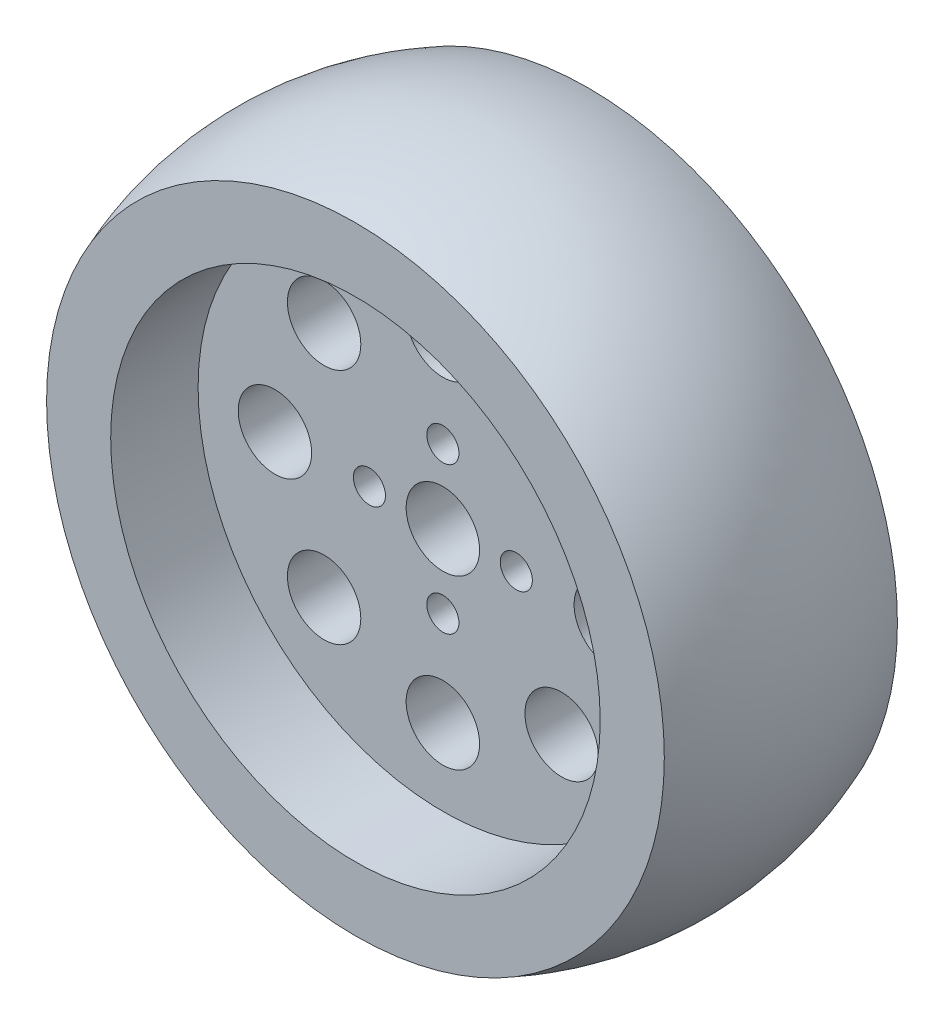
ISO-10303-21;
HEADER;
FILE_DESCRIPTION(('STEP AP214'),'2;1');
FILE_NAME('part.step','',(''),(''),'','','');
FILE_SCHEMA(('AUTOMOTIVE_DESIGN { 1 0 10303 214 1 1 1 1 }'));
ENDSEC;
DATA;
#1=APPLICATION_CONTEXT('core data for automotive mechanical design processes');
#2=APPLICATION_PROTOCOL_DEFINITION('international standard','automotive_design',2000,#1);
#3=PRODUCT_CONTEXT('',#1,'mechanical');
#4=PRODUCT('Part','Part','',(#3));
#5=PRODUCT_RELATED_PRODUCT_CATEGORY('part','',(#4));
#6=PRODUCT_DEFINITION_FORMATION('','',#4);
#7=PRODUCT_DEFINITION_CONTEXT('part definition',#1,'design');
#8=PRODUCT_DEFINITION('design','',#6,#7);
#9=PRODUCT_DEFINITION_SHAPE('','',#8);
#10=(LENGTH_UNIT() NAMED_UNIT(*) SI_UNIT(.MILLI.,.METRE.));
#11=(NAMED_UNIT(*) PLANE_ANGLE_UNIT() SI_UNIT($,.RADIAN.));
#12=(NAMED_UNIT(*) SI_UNIT($,.STERADIAN.) SOLID_ANGLE_UNIT());
#13=UNCERTAINTY_MEASURE_WITH_UNIT(LENGTH_MEASURE(1.E-05),#10,'distance_accuracy_value','');
#14=(GEOMETRIC_REPRESENTATION_CONTEXT(3) GLOBAL_UNCERTAINTY_ASSIGNED_CONTEXT((#13)) GLOBAL_UNIT_ASSIGNED_CONTEXT((#10,
#11,#12)) REPRESENTATION_CONTEXT('',''));
#15=CARTESIAN_POINT('',(0.,0.,0.));
#16=DIRECTION('',(0.,0.,1.));
#17=DIRECTION('',(1.,0.,0.));
#18=AXIS2_PLACEMENT_3D('',#15,#16,#17);
#19=CARTESIAN_POINT('',(0.,0.,2.159));
#20=DIRECTION('',(0.,0.,1.));
#21=DIRECTION('',(1.,0.,0.));
#22=AXIS2_PLACEMENT_3D('',#19,#20,#21);
#23=PLANE('',#22);
#24=CARTESIAN_POINT('',(0.,0.,2.159));
#25=DIRECTION('',(0.,0.,1.));
#26=DIRECTION('',(1.,0.,0.));
#27=AXIS2_PLACEMENT_3D('',#24,#25,#26);
#28=CIRCLE('',#27,26.67);
#29=CARTESIAN_POINT('',(26.67,0.,2.159));
#30=VERTEX_POINT('',#29);
#31=EDGE_CURVE('E43',#30,#30,#28,.T.);
#32=ORIENTED_EDGE('',*,*,#31,.F.);
#33=EDGE_LOOP('',(#32));
#34=FACE_BOUND('',#33,.T.);
#35=CARTESIAN_POINT('',(0.,0.,2.159));
#36=DIRECTION('',(0.,0.,-1.));
#37=DIRECTION('',(-1.,0.,0.));
#38=AXIS2_PLACEMENT_3D('',#35,#36,#37);
#39=CIRCLE('',#38,33.655);
#40=CARTESIAN_POINT('',(-33.655,0.,2.159));
#41=VERTEX_POINT('',#40);
#42=EDGE_CURVE('E50',#41,#41,#39,.T.);
#43=ORIENTED_EDGE('',*,*,#42,.F.);
#44=EDGE_LOOP('',(#43));
#45=FACE_BOUND('',#44,.T.);
#46=ADVANCED_FACE('F30',(#34,#45),#23,.T.);
#47=CARTESIAN_POINT('',(0.,0.,-7.366));
#48=DIRECTION('',(0.,0.,1.));
#49=DIRECTION('',(1.,0.,0.));
#50=AXIS2_PLACEMENT_3D('',#47,#48,#49);
#51=PLANE('',#50);
#52=CARTESIAN_POINT('',(-12.9400540957138,12.9400540957138,-7.366));
#53=DIRECTION('',(0.,0.,1.));
#54=DIRECTION('',(1.,0.,0.));
#55=AXIS2_PLACEMENT_3D('',#52,#53,#54);
#56=CIRCLE('',#55,4.);
#57=CARTESIAN_POINT('',(-8.94005409571382,12.9400540957138,-7.366));
#58=VERTEX_POINT('',#57);
#59=EDGE_CURVE('E103',#58,#58,#56,.T.);
#60=ORIENTED_EDGE('',*,*,#59,.F.);
#61=EDGE_LOOP('',(#60));
#62=FACE_BOUND('',#61,.T.);
#63=CARTESIAN_POINT('',(-12.9400540957138,-12.9400540957138,-7.366));
#64=DIRECTION('',(0.,0.,1.));
#65=DIRECTION('',(1.,0.,0.));
#66=AXIS2_PLACEMENT_3D('',#63,#64,#65);
#67=CIRCLE('',#66,4.);
#68=CARTESIAN_POINT('',(-8.94005409571382,-12.9400540957138,-7.366));
#69=VERTEX_POINT('',#68);
#70=EDGE_CURVE('E93',#69,#69,#67,.T.);
#71=ORIENTED_EDGE('',*,*,#70,.F.);
#72=EDGE_LOOP('',(#71));
#73=FACE_BOUND('',#72,.T.);
#74=CARTESIAN_POINT('',(12.9400540957138,-12.9400540957138,-7.366));
#75=DIRECTION('',(0.,0.,1.));
#76=DIRECTION('',(1.,0.,0.));
#77=AXIS2_PLACEMENT_3D('',#74,#75,#76);
#78=CIRCLE('',#77,4.);
#79=CARTESIAN_POINT('',(16.9400540957138,-12.9400540957138,-7.366));
#80=VERTEX_POINT('',#79);
#81=EDGE_CURVE('E90',#80,#80,#78,.T.);
#82=ORIENTED_EDGE('',*,*,#81,.F.);
#83=EDGE_LOOP('',(#82));
#84=FACE_BOUND('',#83,.T.);
#85=CARTESIAN_POINT('',(12.9400540957138,12.9400540957138,-7.366));
#86=DIRECTION('',(0.,0.,1.));
#87=DIRECTION('',(1.,0.,0.));
#88=AXIS2_PLACEMENT_3D('',#85,#86,#87);
#89=CIRCLE('',#88,4.);
#90=CARTESIAN_POINT('',(16.9400540957138,12.9400540957138,-7.366));
#91=VERTEX_POINT('',#90);
#92=EDGE_CURVE('E87',#91,#91,#89,.T.);
#93=ORIENTED_EDGE('',*,*,#92,.F.);
#94=EDGE_LOOP('',(#93));
#95=FACE_BOUND('',#94,.T.);
#96=CARTESIAN_POINT('',(-18.3,0.,-7.366));
#97=DIRECTION('',(0.,0.,1.));
#98=DIRECTION('',(1.,0.,0.));
#99=AXIS2_PLACEMENT_3D('',#96,#97,#98);
#100=CIRCLE('',#99,4.);
#101=CARTESIAN_POINT('',(-14.3,0.,-7.366));
#102=VERTEX_POINT('',#101);
#103=EDGE_CURVE('E83',#102,#102,#100,.T.);
#104=ORIENTED_EDGE('',*,*,#103,.F.);
#105=EDGE_LOOP('',(#104));
#106=FACE_BOUND('',#105,.T.);
#107=CARTESIAN_POINT('',(0.,-18.3,-7.366));
#108=DIRECTION('',(0.,0.,1.));
#109=DIRECTION('',(1.,0.,0.));
#110=AXIS2_PLACEMENT_3D('',#107,#108,#109);
#111=CIRCLE('',#110,4.);
#112=CARTESIAN_POINT('',(4.,-18.3,-7.366));
#113=VERTEX_POINT('',#112);
#114=EDGE_CURVE('E79',#113,#113,#111,.T.);
#115=ORIENTED_EDGE('',*,*,#114,.F.);
#116=EDGE_LOOP('',(#115));
#117=FACE_BOUND('',#116,.T.);
#118=CARTESIAN_POINT('',(18.3,0.,-7.366));
#119=DIRECTION('',(0.,0.,1.));
#120=DIRECTION('',(1.,0.,0.));
#121=AXIS2_PLACEMENT_3D('',#118,#119,#120);
#122=CIRCLE('',#121,4.);
#123=CARTESIAN_POINT('',(22.3,0.,-7.366));
#124=VERTEX_POINT('',#123);
#125=EDGE_CURVE('E75',#124,#124,#122,.T.);
#126=ORIENTED_EDGE('',*,*,#125,.F.);
#127=EDGE_LOOP('',(#126));
#128=FACE_BOUND('',#127,.T.);
#129=CARTESIAN_POINT('',(0.,18.3,-7.366));
#130=DIRECTION('',(0.,0.,1.));
#131=DIRECTION('',(1.,0.,0.));
#132=AXIS2_PLACEMENT_3D('',#129,#130,#131);
#133=CIRCLE('',#132,4.);
#134=CARTESIAN_POINT('',(4.,18.3,-7.366));
#135=VERTEX_POINT('',#134);
#136=EDGE_CURVE('E71',#135,#135,#133,.T.);
#137=ORIENTED_EDGE('',*,*,#136,.F.);
#138=EDGE_LOOP('',(#137));
#139=FACE_BOUND('',#138,.T.);
#140=CARTESIAN_POINT('',(-8.,0.,-7.366));
#141=DIRECTION('',(0.,0.,1.));
#142=DIRECTION('',(1.,0.,0.));
#143=AXIS2_PLACEMENT_3D('',#140,#141,#142);
#144=CIRCLE('',#143,1.75);
#145=CARTESIAN_POINT('',(-6.25,0.,-7.366));
#146=VERTEX_POINT('',#145);
#147=EDGE_CURVE('E67',#146,#146,#144,.T.);
#148=ORIENTED_EDGE('',*,*,#147,.F.);
#149=EDGE_LOOP('',(#148));
#150=FACE_BOUND('',#149,.T.);
#151=CARTESIAN_POINT('',(0.,-8.,-7.366));
#152=DIRECTION('',(0.,0.,1.));
#153=DIRECTION('',(1.,0.,0.));
#154=AXIS2_PLACEMENT_3D('',#151,#152,#153);
#155=CIRCLE('',#154,1.75);
#156=CARTESIAN_POINT('',(1.75,-8.,-7.366));
#157=VERTEX_POINT('',#156);
#158=EDGE_CURVE('E63',#157,#157,#155,.T.);
#159=ORIENTED_EDGE('',*,*,#158,.F.);
#160=EDGE_LOOP('',(#159));
#161=FACE_BOUND('',#160,.T.);
#162=CARTESIAN_POINT('',(8.,0.,-7.366));
#163=DIRECTION('',(0.,0.,1.));
#164=DIRECTION('',(1.,0.,0.));
#165=AXIS2_PLACEMENT_3D('',#162,#163,#164);
#166=CIRCLE('',#165,1.75);
#167=CARTESIAN_POINT('',(9.75,0.,-7.366));
#168=VERTEX_POINT('',#167);
#169=EDGE_CURVE('E59',#168,#168,#166,.T.);
#170=ORIENTED_EDGE('',*,*,#169,.F.);
#171=EDGE_LOOP('',(#170));
#172=FACE_BOUND('',#171,.T.);
#173=CARTESIAN_POINT('',(0.,8.,-7.366));
#174=DIRECTION('',(0.,0.,1.));
#175=DIRECTION('',(1.,0.,0.));
#176=AXIS2_PLACEMENT_3D('',#173,#174,#175);
#177=CIRCLE('',#176,1.75);
#178=CARTESIAN_POINT('',(1.75,8.,-7.366));
#179=VERTEX_POINT('',#178);
#180=EDGE_CURVE('E55',#179,#179,#177,.T.);
#181=ORIENTED_EDGE('',*,*,#180,.F.);
#182=EDGE_LOOP('',(#181));
#183=FACE_BOUND('',#182,.T.);
#184=CARTESIAN_POINT('',(0.,0.,-7.366));
#185=DIRECTION('',(0.,0.,1.));
#186=DIRECTION('',(1.,0.,0.));
#187=AXIS2_PLACEMENT_3D('',#184,#185,#186);
#188=CIRCLE('',#187,4.);
#189=CARTESIAN_POINT('',(4.,0.,-7.366));
#190=VERTEX_POINT('',#189);
#191=EDGE_CURVE('E51',#190,#190,#188,.T.);
#192=ORIENTED_EDGE('',*,*,#191,.F.);
#193=EDGE_LOOP('',(#192));
#194=FACE_BOUND('',#193,.T.);
#195=CARTESIAN_POINT('',(0.,0.,-7.366));
#196=DIRECTION('',(0.,0.,1.));
#197=DIRECTION('',(1.,0.,0.));
#198=AXIS2_PLACEMENT_3D('',#195,#196,#197);
#199=CIRCLE('',#198,26.67);
#200=CARTESIAN_POINT('',(26.67,0.,-7.366));
#201=VERTEX_POINT('',#200);
#202=EDGE_CURVE('E10',#201,#201,#199,.T.);
#203=ORIENTED_EDGE('',*,*,#202,.T.);
#204=EDGE_LOOP('',(#203));
#205=FACE_BOUND('',#204,.T.);
#206=ADVANCED_FACE('F139',(#62,#73,#84,#95,#106,#117,#128,#139,#150,#161,#172,#183,#194,#205),
#51,.T.);
#207=CARTESIAN_POINT('',(0.,0.,-7.366));
#208=DIRECTION('',(0.,0.,1.));
#209=DIRECTION('',(1.,0.,0.));
#210=AXIS2_PLACEMENT_3D('',#207,#208,#209);
#211=CYLINDRICAL_SURFACE('',#210,26.67);
#212=ORIENTED_EDGE('',*,*,#202,.F.);
#213=EDGE_LOOP('',(#212));
#214=FACE_BOUND('',#213,.T.);
#215=ORIENTED_EDGE('',*,*,#31,.T.);
#216=EDGE_LOOP('',(#215));
#217=FACE_BOUND('',#216,.T.);
#218=ADVANCED_FACE('F32',(#214,#217),#211,.F.);
#219=CARTESIAN_POINT('',(0.,0.,-10.541));
#220=DIRECTION('',(0.,0.,-1.));
#221=DIRECTION('',(-1.,0.,0.));
#222=AXIS2_PLACEMENT_3D('',#219,#220,#221);
#223=DEGENERATE_TOROIDAL_SURFACE('',#222,1.8774674519895,34.2213613820355,.T.);
#224=CARTESIAN_POINT('',(0.,0.,-23.241));
#225=DIRECTION('',(0.,0.,-1.));
#226=DIRECTION('',(-1.,0.,0.));
#227=AXIS2_PLACEMENT_3D('',#224,#225,#226);
#228=CIRCLE('',#227,33.655);
#229=CARTESIAN_POINT('',(-33.655,0.,-23.241));
#230=VERTEX_POINT('',#229);
#231=EDGE_CURVE('E128',#230,#230,#228,.T.);
#232=ORIENTED_EDGE('',*,*,#231,.F.);
#233=EDGE_LOOP('',(#232));
#234=FACE_BOUND('',#233,.T.);
#235=ORIENTED_EDGE('',*,*,#42,.T.);
#236=EDGE_LOOP('',(#235));
#237=FACE_BOUND('',#236,.T.);
#238=ADVANCED_FACE('F143',(#234,#237),#223,.T.);
#239=CARTESIAN_POINT('',(0.,0.,-13.716));
#240=DIRECTION('',(0.,0.,-1.));
#241=DIRECTION('',(-1.,0.,0.));
#242=AXIS2_PLACEMENT_3D('',#239,#240,#241);
#243=PLANE('',#242);
#244=CARTESIAN_POINT('',(-12.9400540957138,12.9400540957138,-13.716));
#245=DIRECTION('',(0.,0.,-1.));
#246=DIRECTION('',(-1.,0.,0.));
#247=AXIS2_PLACEMENT_3D('',#244,#245,#246);
#248=CIRCLE('',#247,4.);
#249=CARTESIAN_POINT('',(-16.9400540957138,12.9400540957138,-13.716));
#250=VERTEX_POINT('',#249);
#251=EDGE_CURVE('E34',#250,#250,#248,.T.);
#252=ORIENTED_EDGE('',*,*,#251,.F.);
#253=EDGE_LOOP('',(#252));
#254=FACE_BOUND('',#253,.T.);
#255=CARTESIAN_POINT('',(-12.9400540957138,-12.9400540957138,-13.716));
#256=DIRECTION('',(0.,0.,-1.));
#257=DIRECTION('',(-1.,0.,0.));
#258=AXIS2_PLACEMENT_3D('',#255,#256,#257);
#259=CIRCLE('',#258,4.);
#260=CARTESIAN_POINT('',(-16.9400540957138,-12.9400540957138,-13.716));
#261=VERTEX_POINT('',#260);
#262=EDGE_CURVE('E91',#261,#261,#259,.T.);
#263=ORIENTED_EDGE('',*,*,#262,.F.);
#264=EDGE_LOOP('',(#263));
#265=FACE_BOUND('',#264,.T.);
#266=CARTESIAN_POINT('',(12.9400540957138,-12.9400540957138,-13.716));
#267=DIRECTION('',(0.,0.,-1.));
#268=DIRECTION('',(-1.,0.,0.));
#269=AXIS2_PLACEMENT_3D('',#266,#267,#268);
#270=CIRCLE('',#269,4.);
#271=CARTESIAN_POINT('',(8.94005409571382,-12.9400540957138,-13.716));
#272=VERTEX_POINT('',#271);
#273=EDGE_CURVE('E88',#272,#272,#270,.T.);
#274=ORIENTED_EDGE('',*,*,#273,.F.);
#275=EDGE_LOOP('',(#274));
#276=FACE_BOUND('',#275,.T.);
#277=CARTESIAN_POINT('',(12.9400540957138,12.9400540957138,-13.716));
#278=DIRECTION('',(0.,0.,-1.));
#279=DIRECTION('',(-1.,0.,0.));
#280=AXIS2_PLACEMENT_3D('',#277,#278,#279);
#281=CIRCLE('',#280,4.);
#282=CARTESIAN_POINT('',(8.94005409571382,12.9400540957138,-13.716));
#283=VERTEX_POINT('',#282);
#284=EDGE_CURVE('E84',#283,#283,#281,.T.);
#285=ORIENTED_EDGE('',*,*,#284,.F.);
#286=EDGE_LOOP('',(#285));
#287=FACE_BOUND('',#286,.T.);
#288=CARTESIAN_POINT('',(-18.3,0.,-13.716));
#289=DIRECTION('',(0.,0.,-1.));
#290=DIRECTION('',(-1.,0.,0.));
#291=AXIS2_PLACEMENT_3D('',#288,#289,#290);
#292=CIRCLE('',#291,4.);
#293=CARTESIAN_POINT('',(-22.3,0.,-13.716));
#294=VERTEX_POINT('',#293);
#295=EDGE_CURVE('E80',#294,#294,#292,.T.);
#296=ORIENTED_EDGE('',*,*,#295,.F.);
#297=EDGE_LOOP('',(#296));
#298=FACE_BOUND('',#297,.T.);
#299=CARTESIAN_POINT('',(0.,-18.3,-13.716));
#300=DIRECTION('',(0.,0.,-1.));
#301=DIRECTION('',(-1.,0.,0.));
#302=AXIS2_PLACEMENT_3D('',#299,#300,#301);
#303=CIRCLE('',#302,4.);
#304=CARTESIAN_POINT('',(-4.,-18.3,-13.716));
#305=VERTEX_POINT('',#304);
#306=EDGE_CURVE('E76',#305,#305,#303,.T.);
#307=ORIENTED_EDGE('',*,*,#306,.F.);
#308=EDGE_LOOP('',(#307));
#309=FACE_BOUND('',#308,.T.);
#310=CARTESIAN_POINT('',(18.3,0.,-13.716));
#311=DIRECTION('',(0.,0.,-1.));
#312=DIRECTION('',(-1.,0.,0.));
#313=AXIS2_PLACEMENT_3D('',#310,#311,#312);
#314=CIRCLE('',#313,4.);
#315=CARTESIAN_POINT('',(14.3,0.,-13.716));
#316=VERTEX_POINT('',#315);
#317=EDGE_CURVE('E72',#316,#316,#314,.T.);
#318=ORIENTED_EDGE('',*,*,#317,.F.);
#319=EDGE_LOOP('',(#318));
#320=FACE_BOUND('',#319,.T.);
#321=CARTESIAN_POINT('',(0.,18.3,-13.716));
#322=DIRECTION('',(0.,0.,-1.));
#323=DIRECTION('',(-1.,0.,0.));
#324=AXIS2_PLACEMENT_3D('',#321,#322,#323);
#325=CIRCLE('',#324,4.);
#326=CARTESIAN_POINT('',(-4.,18.3,-13.716));
#327=VERTEX_POINT('',#326);
#328=EDGE_CURVE('E68',#327,#327,#325,.T.);
#329=ORIENTED_EDGE('',*,*,#328,.F.);
#330=EDGE_LOOP('',(#329));
#331=FACE_BOUND('',#330,.T.);
#332=CARTESIAN_POINT('',(-8.,0.,-13.716));
#333=DIRECTION('',(0.,0.,-1.));
#334=DIRECTION('',(-1.,0.,0.));
#335=AXIS2_PLACEMENT_3D('',#332,#333,#334);
#336=CIRCLE('',#335,1.75);
#337=CARTESIAN_POINT('',(-9.75,0.,-13.716));
#338=VERTEX_POINT('',#337);
#339=EDGE_CURVE('E64',#338,#338,#336,.T.);
#340=ORIENTED_EDGE('',*,*,#339,.F.);
#341=EDGE_LOOP('',(#340));
#342=FACE_BOUND('',#341,.T.);
#343=CARTESIAN_POINT('',(0.,-8.,-13.716));
#344=DIRECTION('',(0.,0.,-1.));
#345=DIRECTION('',(-1.,0.,0.));
#346=AXIS2_PLACEMENT_3D('',#343,#344,#345);
#347=CIRCLE('',#346,1.75);
#348=CARTESIAN_POINT('',(-1.75,-8.,-13.716));
#349=VERTEX_POINT('',#348);
#350=EDGE_CURVE('E60',#349,#349,#347,.T.);
#351=ORIENTED_EDGE('',*,*,#350,.F.);
#352=EDGE_LOOP('',(#351));
#353=FACE_BOUND('',#352,.T.);
#354=CARTESIAN_POINT('',(8.,0.,-13.716));
#355=DIRECTION('',(0.,0.,-1.));
#356=DIRECTION('',(-1.,0.,0.));
#357=AXIS2_PLACEMENT_3D('',#354,#355,#356);
#358=CIRCLE('',#357,1.75);
#359=CARTESIAN_POINT('',(6.25,0.,-13.716));
#360=VERTEX_POINT('',#359);
#361=EDGE_CURVE('E56',#360,#360,#358,.T.);
#362=ORIENTED_EDGE('',*,*,#361,.F.);
#363=EDGE_LOOP('',(#362));
#364=FACE_BOUND('',#363,.T.);
#365=CARTESIAN_POINT('',(0.,8.,-13.716));
#366=DIRECTION('',(0.,0.,-1.));
#367=DIRECTION('',(-1.,0.,0.));
#368=AXIS2_PLACEMENT_3D('',#365,#366,#367);
#369=CIRCLE('',#368,1.75);
#370=CARTESIAN_POINT('',(-1.75,8.,-13.716));
#371=VERTEX_POINT('',#370);
#372=EDGE_CURVE('E52',#371,#371,#369,.T.);
#373=ORIENTED_EDGE('',*,*,#372,.F.);
#374=EDGE_LOOP('',(#373));
#375=FACE_BOUND('',#374,.T.);
#376=CARTESIAN_POINT('',(0.,0.,-13.716));
#377=DIRECTION('',(0.,0.,-1.));
#378=DIRECTION('',(-1.,0.,0.));
#379=AXIS2_PLACEMENT_3D('',#376,#377,#378);
#380=CIRCLE('',#379,4.);
#381=CARTESIAN_POINT('',(-4.,0.,-13.716));
#382=VERTEX_POINT('',#381);
#383=EDGE_CURVE('E47',#382,#382,#380,.T.);
#384=ORIENTED_EDGE('',*,*,#383,.F.);
#385=EDGE_LOOP('',(#384));
#386=FACE_BOUND('',#385,.T.);
#387=CARTESIAN_POINT('',(0.,0.,-13.716));
#388=DIRECTION('',(0.,0.,-1.));
#389=DIRECTION('',(-1.,0.,0.));
#390=AXIS2_PLACEMENT_3D('',#387,#388,#389);
#391=CIRCLE('',#390,26.67);
#392=CARTESIAN_POINT('',(-26.67,0.,-13.716));
#393=VERTEX_POINT('',#392);
#394=EDGE_CURVE('E38',#393,#393,#391,.T.);
#395=ORIENTED_EDGE('',*,*,#394,.T.);
#396=EDGE_LOOP('',(#395));
#397=FACE_BOUND('',#396,.T.);
#398=ADVANCED_FACE('F145',(#254,#265,#276,#287,#298,#309,#320,#331,#342,#353,#364,#375,#386,
#397),#243,.T.);
#399=CARTESIAN_POINT('',(0.,0.,-13.716));
#400=DIRECTION('',(0.,0.,-1.));
#401=DIRECTION('',(-1.,0.,0.));
#402=AXIS2_PLACEMENT_3D('',#399,#400,#401);
#403=CYLINDRICAL_SURFACE('',#402,26.67);
#404=ORIENTED_EDGE('',*,*,#394,.F.);
#405=EDGE_LOOP('',(#404));
#406=FACE_BOUND('',#405,.T.);
#407=CARTESIAN_POINT('',(0.,0.,-23.241));
#408=DIRECTION('',(0.,0.,-1.));
#409=DIRECTION('',(-1.,0.,0.));
#410=AXIS2_PLACEMENT_3D('',#407,#408,#409);
#411=CIRCLE('',#410,26.67);
#412=CARTESIAN_POINT('',(-26.67,0.,-23.241));
#413=VERTEX_POINT('',#412);
#414=EDGE_CURVE('E131',#413,#413,#411,.T.);
#415=ORIENTED_EDGE('',*,*,#414,.T.);
#416=EDGE_LOOP('',(#415));
#417=FACE_BOUND('',#416,.T.);
#418=ADVANCED_FACE('F152',(#406,#417),#403,.F.);
#419=CARTESIAN_POINT('',(0.,0.,-23.241));
#420=DIRECTION('',(0.,0.,-1.));
#421=DIRECTION('',(-1.,0.,0.));
#422=AXIS2_PLACEMENT_3D('',#419,#420,#421);
#423=PLANE('',#422);
#424=ORIENTED_EDGE('',*,*,#414,.F.);
#425=EDGE_LOOP('',(#424));
#426=FACE_BOUND('',#425,.T.);
#427=ORIENTED_EDGE('',*,*,#231,.T.);
#428=EDGE_LOOP('',(#427));
#429=FACE_BOUND('',#428,.T.);
#430=ADVANCED_FACE('F161',(#426,#429),#423,.T.);
#431=CARTESIAN_POINT('',(0.,0.,-23.241));
#432=DIRECTION('',(0.,0.,1.));
#433=DIRECTION('',(1.,0.,0.));
#434=AXIS2_PLACEMENT_3D('',#431,#432,#433);
#435=CYLINDRICAL_SURFACE('',#434,4.);
#436=ORIENTED_EDGE('',*,*,#383,.T.);
#437=EDGE_LOOP('',(#436));
#438=FACE_BOUND('',#437,.T.);
#439=ORIENTED_EDGE('',*,*,#191,.T.);
#440=EDGE_LOOP('',(#439));
#441=FACE_BOUND('',#440,.T.);
#442=ADVANCED_FACE('F159',(#438,#441),#435,.F.);
#443=CARTESIAN_POINT('',(0.,8.,-23.241));
#444=DIRECTION('',(0.,0.,1.));
#445=DIRECTION('',(1.,0.,0.));
#446=AXIS2_PLACEMENT_3D('',#443,#444,#445);
#447=CYLINDRICAL_SURFACE('',#446,1.75);
#448=ORIENTED_EDGE('',*,*,#372,.T.);
#449=EDGE_LOOP('',(#448));
#450=FACE_BOUND('',#449,.T.);
#451=ORIENTED_EDGE('',*,*,#180,.T.);
#452=EDGE_LOOP('',(#451));
#453=FACE_BOUND('',#452,.T.);
#454=ADVANCED_FACE('F198',(#450,#453),#447,.F.);
#455=CARTESIAN_POINT('',(8.,0.,-23.241));
#456=DIRECTION('',(0.,0.,1.));
#457=DIRECTION('',(1.,0.,0.));
#458=AXIS2_PLACEMENT_3D('',#455,#456,#457);
#459=CYLINDRICAL_SURFACE('',#458,1.75);
#460=ORIENTED_EDGE('',*,*,#361,.T.);
#461=EDGE_LOOP('',(#460));
#462=FACE_BOUND('',#461,.T.);
#463=ORIENTED_EDGE('',*,*,#169,.T.);
#464=EDGE_LOOP('',(#463));
#465=FACE_BOUND('',#464,.T.);
#466=ADVANCED_FACE('F203',(#462,#465),#459,.F.);
#467=CARTESIAN_POINT('',(0.,-8.,-23.241));
#468=DIRECTION('',(0.,0.,1.));
#469=DIRECTION('',(1.,0.,0.));
#470=AXIS2_PLACEMENT_3D('',#467,#468,#469);
#471=CYLINDRICAL_SURFACE('',#470,1.75);
#472=ORIENTED_EDGE('',*,*,#350,.T.);
#473=EDGE_LOOP('',(#472));
#474=FACE_BOUND('',#473,.T.);
#475=ORIENTED_EDGE('',*,*,#158,.T.);
#476=EDGE_LOOP('',(#475));
#477=FACE_BOUND('',#476,.T.);
#478=ADVANCED_FACE('F215',(#474,#477),#471,.F.);
#479=CARTESIAN_POINT('',(-8.,0.,-23.241));
#480=DIRECTION('',(0.,0.,1.));
#481=DIRECTION('',(1.,0.,0.));
#482=AXIS2_PLACEMENT_3D('',#479,#480,#481);
#483=CYLINDRICAL_SURFACE('',#482,1.75);
#484=ORIENTED_EDGE('',*,*,#339,.T.);
#485=EDGE_LOOP('',(#484));
#486=FACE_BOUND('',#485,.T.);
#487=ORIENTED_EDGE('',*,*,#147,.T.);
#488=EDGE_LOOP('',(#487));
#489=FACE_BOUND('',#488,.T.);
#490=ADVANCED_FACE('F222',(#486,#489),#483,.F.);
#491=CARTESIAN_POINT('',(0.,18.3,-23.241));
#492=DIRECTION('',(0.,0.,1.));
#493=DIRECTION('',(1.,0.,0.));
#494=AXIS2_PLACEMENT_3D('',#491,#492,#493);
#495=CYLINDRICAL_SURFACE('',#494,4.);
#496=ORIENTED_EDGE('',*,*,#328,.T.);
#497=EDGE_LOOP('',(#496));
#498=FACE_BOUND('',#497,.T.);
#499=ORIENTED_EDGE('',*,*,#136,.T.);
#500=EDGE_LOOP('',(#499));
#501=FACE_BOUND('',#500,.T.);
#502=ADVANCED_FACE('F226',(#498,#501),#495,.F.);
#503=CARTESIAN_POINT('',(18.3,0.,-23.241));
#504=DIRECTION('',(0.,0.,1.));
#505=DIRECTION('',(1.,0.,0.));
#506=AXIS2_PLACEMENT_3D('',#503,#504,#505);
#507=CYLINDRICAL_SURFACE('',#506,4.);
#508=ORIENTED_EDGE('',*,*,#317,.T.);
#509=EDGE_LOOP('',(#508));
#510=FACE_BOUND('',#509,.T.);
#511=ORIENTED_EDGE('',*,*,#125,.T.);
#512=EDGE_LOOP('',(#511));
#513=FACE_BOUND('',#512,.T.);
#514=ADVANCED_FACE('F230',(#510,#513),#507,.F.);
#515=CARTESIAN_POINT('',(0.,-18.3,-23.241));
#516=DIRECTION('',(0.,0.,1.));
#517=DIRECTION('',(1.,0.,0.));
#518=AXIS2_PLACEMENT_3D('',#515,#516,#517);
#519=CYLINDRICAL_SURFACE('',#518,4.);
#520=ORIENTED_EDGE('',*,*,#306,.T.);
#521=EDGE_LOOP('',(#520));
#522=FACE_BOUND('',#521,.T.);
#523=ORIENTED_EDGE('',*,*,#114,.T.);
#524=EDGE_LOOP('',(#523));
#525=FACE_BOUND('',#524,.T.);
#526=ADVANCED_FACE('F234',(#522,#525),#519,.F.);
#527=CARTESIAN_POINT('',(-18.3,0.,-23.241));
#528=DIRECTION('',(0.,0.,1.));
#529=DIRECTION('',(1.,0.,0.));
#530=AXIS2_PLACEMENT_3D('',#527,#528,#529);
#531=CYLINDRICAL_SURFACE('',#530,4.);
#532=ORIENTED_EDGE('',*,*,#295,.T.);
#533=EDGE_LOOP('',(#532));
#534=FACE_BOUND('',#533,.T.);
#535=ORIENTED_EDGE('',*,*,#103,.T.);
#536=EDGE_LOOP('',(#535));
#537=FACE_BOUND('',#536,.T.);
#538=ADVANCED_FACE('F238',(#534,#537),#531,.F.);
#539=CARTESIAN_POINT('',(12.9400540957138,12.9400540957138,-23.241));
#540=DIRECTION('',(0.,0.,1.));
#541=DIRECTION('',(1.,0.,0.));
#542=AXIS2_PLACEMENT_3D('',#539,#540,#541);
#543=CYLINDRICAL_SURFACE('',#542,4.);
#544=ORIENTED_EDGE('',*,*,#284,.T.);
#545=EDGE_LOOP('',(#544));
#546=FACE_BOUND('',#545,.T.);
#547=ORIENTED_EDGE('',*,*,#92,.T.);
#548=EDGE_LOOP('',(#547));
#549=FACE_BOUND('',#548,.T.);
#550=ADVANCED_FACE('F242',(#546,#549),#543,.F.);
#551=CARTESIAN_POINT('',(12.9400540957138,-12.9400540957138,-23.241));
#552=DIRECTION('',(0.,0.,1.));
#553=DIRECTION('',(1.,0.,0.));
#554=AXIS2_PLACEMENT_3D('',#551,#552,#553);
#555=CYLINDRICAL_SURFACE('',#554,4.);
#556=ORIENTED_EDGE('',*,*,#273,.T.);
#557=EDGE_LOOP('',(#556));
#558=FACE_BOUND('',#557,.T.);
#559=ORIENTED_EDGE('',*,*,#81,.T.);
#560=EDGE_LOOP('',(#559));
#561=FACE_BOUND('',#560,.T.);
#562=ADVANCED_FACE('F246',(#558,#561),#555,.F.);
#563=CARTESIAN_POINT('',(-12.9400540957138,-12.9400540957138,-23.241));
#564=DIRECTION('',(0.,0.,1.));
#565=DIRECTION('',(1.,0.,0.));
#566=AXIS2_PLACEMENT_3D('',#563,#564,#565);
#567=CYLINDRICAL_SURFACE('',#566,4.);
#568=ORIENTED_EDGE('',*,*,#262,.T.);
#569=EDGE_LOOP('',(#568));
#570=FACE_BOUND('',#569,.T.);
#571=ORIENTED_EDGE('',*,*,#70,.T.);
#572=EDGE_LOOP('',(#571));
#573=FACE_BOUND('',#572,.T.);
#574=ADVANCED_FACE('F250',(#570,#573),#567,.F.);
#575=CARTESIAN_POINT('',(-12.9400540957138,12.9400540957138,-23.241));
#576=DIRECTION('',(0.,0.,1.));
#577=DIRECTION('',(1.,0.,0.));
#578=AXIS2_PLACEMENT_3D('',#575,#576,#577);
#579=CYLINDRICAL_SURFACE('',#578,4.);
#580=ORIENTED_EDGE('',*,*,#251,.T.);
#581=EDGE_LOOP('',(#580));
#582=FACE_BOUND('',#581,.T.);
#583=ORIENTED_EDGE('',*,*,#59,.T.);
#584=EDGE_LOOP('',(#583));
#585=FACE_BOUND('',#584,.T.);
#586=ADVANCED_FACE('F254',(#582,#585),#579,.F.);
#587=CLOSED_SHELL('',(#46,#206,#218,#238,#398,#418,#430,#442,#454,#466,#478,#490,#502,#514,#526,
#538,#550,#562,#574,#586));
#588=MANIFOLD_SOLID_BREP('B2',#587);
#589=ADVANCED_BREP_SHAPE_REPRESENTATION('',(#18,#588),#14);
#590=SHAPE_DEFINITION_REPRESENTATION(#9,#589);
ENDSEC;
END-ISO-10303-21;
